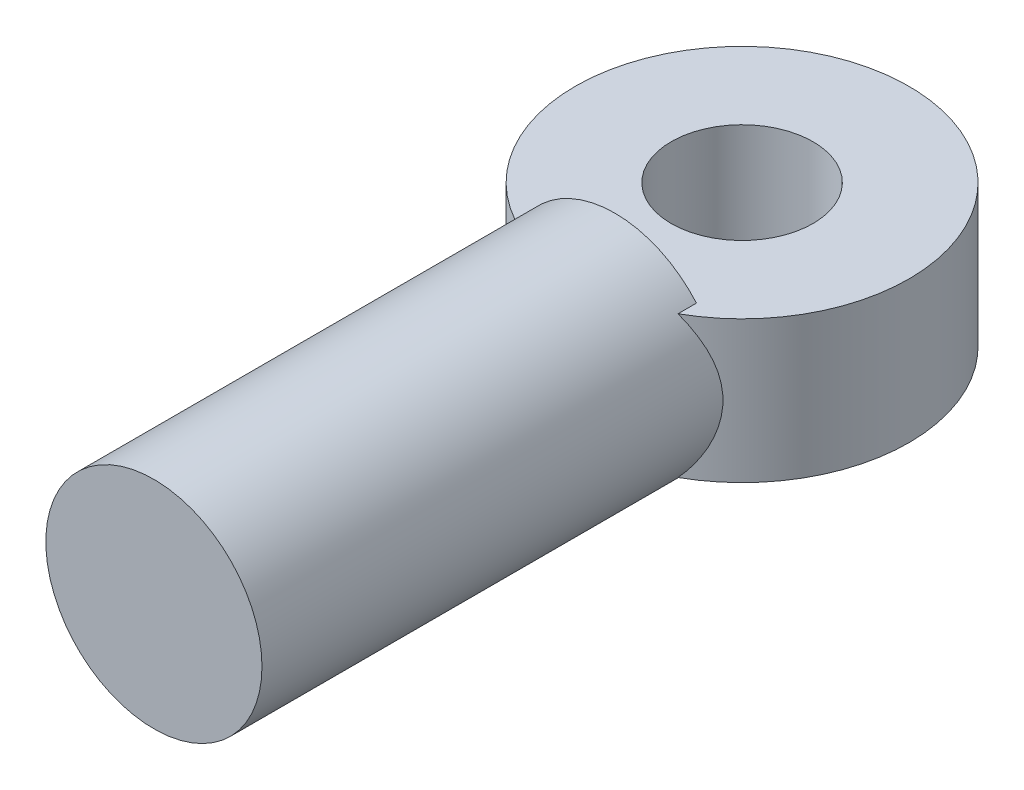
ISO-10303-21;
HEADER;
FILE_DESCRIPTION(('STEP AP214'),'2;1');
FILE_NAME('part.step','',(''),(''),'','','');
FILE_SCHEMA(('AUTOMOTIVE_DESIGN { 1 0 10303 214 1 1 1 1 }'));
ENDSEC;
DATA;
#1=APPLICATION_CONTEXT('core data for automotive mechanical design processes');
#2=APPLICATION_PROTOCOL_DEFINITION('international standard','automotive_design',2000,#1);
#3=PRODUCT_CONTEXT('',#1,'mechanical');
#4=PRODUCT('Part','Part','',(#3));
#5=PRODUCT_RELATED_PRODUCT_CATEGORY('part','',(#4));
#6=PRODUCT_DEFINITION_FORMATION('','',#4);
#7=PRODUCT_DEFINITION_CONTEXT('part definition',#1,'design');
#8=PRODUCT_DEFINITION('design','',#6,#7);
#9=PRODUCT_DEFINITION_SHAPE('','',#8);
#10=(LENGTH_UNIT() NAMED_UNIT(*) SI_UNIT(.MILLI.,.METRE.));
#11=(NAMED_UNIT(*) PLANE_ANGLE_UNIT() SI_UNIT($,.RADIAN.));
#12=(NAMED_UNIT(*) SI_UNIT($,.STERADIAN.) SOLID_ANGLE_UNIT());
#13=UNCERTAINTY_MEASURE_WITH_UNIT(LENGTH_MEASURE(1.E-05),#10,'distance_accuracy_value','');
#14=(GEOMETRIC_REPRESENTATION_CONTEXT(3) GLOBAL_UNCERTAINTY_ASSIGNED_CONTEXT((#13)) GLOBAL_UNIT_ASSIGNED_CONTEXT((#10,
#11,#12)) REPRESENTATION_CONTEXT('',''));
#15=CARTESIAN_POINT('',(0.,0.,0.));
#16=DIRECTION('',(0.,0.,1.));
#17=DIRECTION('',(1.,0.,0.));
#18=AXIS2_PLACEMENT_3D('',#15,#16,#17);
#19=CARTESIAN_POINT('',(0.,0.,130.));
#20=DIRECTION('',(0.,0.,-1.));
#21=DIRECTION('',(-1.,0.,0.));
#22=AXIS2_PLACEMENT_3D('',#19,#20,#21);
#23=CYLINDRICAL_SURFACE('',#22,30.475);
#24=CARTESIAN_POINT('',(0.,0.,130.));
#25=DIRECTION('',(0.,0.,1.));
#26=DIRECTION('',(1.,0.,0.));
#27=AXIS2_PLACEMENT_3D('',#24,#25,#26);
#28=CIRCLE('',#27,30.475);
#29=CARTESIAN_POINT('',(30.475,0.,130.));
#30=VERTEX_POINT('',#29);
#31=EDGE_CURVE('E89',#30,#30,#28,.T.);
#32=ORIENTED_EDGE('',*,*,#31,.F.);
#33=EDGE_LOOP('',(#32));
#34=FACE_BOUND('',#33,.T.);
#35=CARTESIAN_POINT('',(22.994034552466,20.,5.20044101858887));
#36=CARTESIAN_POINT('',(23.2608627606317,19.6932167851979,5.0510105347455));
#37=CARTESIAN_POINT('',(23.5215381915526,19.381129315537,4.90160505695657));
#38=CARTESIAN_POINT('',(24.0303988975387,18.7464955657177,4.6036870782934));
#39=CARTESIAN_POINT('',(24.2785836318345,18.4239488337306,4.45517461632586));
#40=CARTESIAN_POINT('',(25.0044555233946,17.4403909240791,4.0120382310546));
#41=CARTESIAN_POINT('',(25.4630575761795,16.7639249251453,3.7200431066798));
#42=CARTESIAN_POINT('',(26.3305801628501,15.3658376380825,3.14833652555004));
#43=CARTESIAN_POINT('',(26.7390371257926,14.6438766549575,2.86875302352362));
#44=CARTESIAN_POINT('',(27.498616841986,13.1622268551506,2.33314396882924));
#45=CARTESIAN_POINT('',(27.8497621900792,12.402553061372,2.07710914966177));
#46=CARTESIAN_POINT('',(28.4369507095093,10.9796775832088,1.63829560516049));
#47=CARTESIAN_POINT('',(28.6824159286412,10.3219194580273,1.45045339790217));
#48=CARTESIAN_POINT('',(29.1291163895994,8.98427724242844,1.10274151145618));
#49=CARTESIAN_POINT('',(29.3303542471918,8.30439446327515,0.942870178083905));
#50=CARTESIAN_POINT('',(29.6855378881333,6.92803746822048,0.656962159062035));
#51=CARTESIAN_POINT('',(29.839650192946,6.23163126737512,0.530806540517424));
#52=CARTESIAN_POINT('',(30.099279236282,4.8240115852771,0.316350118499478));
#53=CARTESIAN_POINT('',(30.2047971165537,4.11279845233054,0.228048425634087));
#54=CARTESIAN_POINT('',(30.3660200497119,2.67532616820119,0.0924922603360886));
#55=CARTESIAN_POINT('',(30.4213435011484,1.94899400247953,0.0455523154738384));
#56=CARTESIAN_POINT('',(30.4797289961815,0.492699810239906,-0.00399859933806714));
#57=CARTESIAN_POINT('',(30.4827911039367,-0.237262211820756,-0.00660962370810891));
#58=CARTESIAN_POINT('',(30.4365831898761,-1.69466320939582,0.0326265019580304));
#59=CARTESIAN_POINT('',(30.3872873558604,-2.42210076290578,0.0744955804617325));
#60=CARTESIAN_POINT('',(30.2372853522793,-3.86786616525834,0.200811383262043));
#61=CARTESIAN_POINT('',(30.1365801505275,-4.58619418533277,0.285257306022325));
#62=CARTESIAN_POINT('',(29.8975212450236,-5.94062060959554,0.483181938963667));
#63=CARTESIAN_POINT('',(29.763657829504,-6.57804331090867,0.593136586533963));
#64=CARTESIAN_POINT('',(29.4569747546435,-7.83789149491519,0.841417134090041));
#65=CARTESIAN_POINT('',(29.2841514358959,-8.46031556274158,0.979745699057118));
#66=CARTESIAN_POINT('',(28.9969543012618,-9.3811505990774,1.20563608798631));
#67=CARTESIAN_POINT('',(28.8964534742172,-9.68624396109955,1.2840818864562));
#68=CARTESIAN_POINT('',(28.6863914963508,-10.2917055110156,1.44656012393503));
#69=CARTESIAN_POINT('',(28.5768325244269,-10.5920748146898,1.530591218477));
#70=CARTESIAN_POINT('',(28.2348349315823,-11.4859390771215,1.7903419536873));
#71=CARTESIAN_POINT('',(27.9890803491207,-12.0721753148364,1.97371530375355));
#72=CARTESIAN_POINT('',(27.4182274952725,-13.3235884418352,2.38997690140687));
#73=CARTESIAN_POINT('',(27.0867601611449,-13.9848292255156,2.62593770093779));
#74=CARTESIAN_POINT('',(26.3795307763607,-15.2770612366278,3.11412466884062));
#75=CARTESIAN_POINT('',(26.0037581828735,-15.9080452137315,3.36635470212777));
#76=CARTESIAN_POINT('',(25.2120584164382,-17.1349970688917,3.87982399317274));
#77=CARTESIAN_POINT('',(24.7963585934392,-17.7311353521741,4.14100736345609));
#78=CARTESIAN_POINT('',(23.9248940596249,-18.8904708528855,4.6682974355996));
#79=CARTESIAN_POINT('',(23.4691528347827,-19.453687061879,4.93440118007924));
#80=CARTESIAN_POINT('',(22.994034552466,-20.,5.20044101858887));
#81=B_SPLINE_CURVE_WITH_KNOTS('',3,(#35,#36,#37,#38,#39,#40,#41,#42,#43,#44,#45,#46,#47,#48,#49,
#50,#51,#52,#53,#54,#55,#56,#57,#58,#59,#60,#61,#62,#63,#64,#65,#66,#67,#68,#69,#70,#71,#72,#73,
#74,#75,#76,#77,#78,#79,#80),.UNSPECIFIED.,.F.,.F.,(4,2,2,2,2,2,2,2,2,2,2,2,2,2,2,2,2,2,2,2,2,2,
4),(0.,1.29937057520426,2.59879735676656,5.19960945163365,7.82289654321589,10.445146904532,
12.6234152952694,14.8015548206402,16.9719063455603,19.1422068744694,21.3288720550141,
23.5155345510997,25.7032755612995,27.8909753874133,29.8706582047298,31.8505270462519,
32.8423352292634,33.8339055273623,35.8170947063017,38.1441325492506,40.4717252533956,
42.7867722442928,45.1004703134615),.UNSPECIFIED.);
#82=CARTESIAN_POINT('',(22.994034552466,20.,5.20044101858887));
#83=VERTEX_POINT('',#82);
#84=CARTESIAN_POINT('',(22.994034552466,-20.,5.20044101858887));
#85=VERTEX_POINT('',#84);
#86=EDGE_CURVE('E49',#83,#85,#81,.T.);
#87=ORIENTED_EDGE('',*,*,#86,.F.);
#88=DIRECTION('',(0.,0.,-1.));
#89=VECTOR('',#88,1.);
#90=CARTESIAN_POINT('',(22.994034552466,20.,130.));
#91=LINE('',#90,#89);
#92=CARTESIAN_POINT('',(22.994034552466,20.,0.));
#93=VERTEX_POINT('',#92);
#94=EDGE_CURVE('E195',#83,#93,#91,.T.);
#95=ORIENTED_EDGE('',*,*,#94,.T.);
#96=CARTESIAN_POINT('',(0.,0.,0.));
#97=DIRECTION('',(0.,0.,1.));
#98=DIRECTION('',(1.,0.,0.));
#99=AXIS2_PLACEMENT_3D('',#96,#97,#98);
#100=CIRCLE('',#99,30.475);
#101=CARTESIAN_POINT('',(-22.994034552466,20.,0.));
#102=VERTEX_POINT('',#101);
#103=EDGE_CURVE('E77',#93,#102,#100,.T.);
#104=ORIENTED_EDGE('',*,*,#103,.T.);
#105=DIRECTION('',(0.,0.,-1.));
#106=VECTOR('',#105,1.);
#107=CARTESIAN_POINT('',(-22.994034552466,20.,130.));
#108=LINE('',#107,#106);
#109=CARTESIAN_POINT('',(-22.994034552466,20.,5.20044101858887));
#110=VERTEX_POINT('',#109);
#111=EDGE_CURVE('E194',#102,#110,#108,.F.);
#112=ORIENTED_EDGE('',*,*,#111,.T.);
#113=CARTESIAN_POINT('',(-22.994034552466,-20.,5.20044101858887));
#114=CARTESIAN_POINT('',(-23.2607453373748,-19.6933532428766,5.05107656439186));
#115=CARTESIAN_POINT('',(-23.5213109912777,-19.3814020159014,4.90173540072261));
#116=CARTESIAN_POINT('',(-24.029956547805,-18.747057898321,4.60394872601959));
#117=CARTESIAN_POINT('',(-24.2780362319215,-18.4246648251428,4.45550323070024));
#118=CARTESIAN_POINT('',(-25.003628419681,-17.4415630614047,4.01255427935034));
#119=CARTESIAN_POINT('',(-25.4620641823545,-16.7654258541019,3.72068147280247));
#120=CARTESIAN_POINT('',(-26.3297264758448,-15.3673141358282,3.14891552267168));
#121=CARTESIAN_POINT('',(-26.7384439519203,-14.6449650818137,2.86916258587108));
#122=CARTESIAN_POINT('',(-27.3083771309743,-13.5333460733198,2.46729369756817));
#123=CARTESIAN_POINT('',(-27.4911369982993,-13.1581898717125,2.33631820595618));
#124=CARTESIAN_POINT('',(-27.8419671401901,-12.3986113056531,2.08133892609134));
#125=CARTESIAN_POINT('',(-28.0100335405742,-12.0141865312671,1.95733697958819));
#126=CARTESIAN_POINT('',(-28.4371676191001,-10.9791468551821,1.63813238469832));
#127=CARTESIAN_POINT('',(-28.6828682399565,-10.3207043749688,1.45010674203795));
#128=CARTESIAN_POINT('',(-29.1298860149142,-8.9818329066453,1.10213699084973));
#129=CARTESIAN_POINT('',(-29.3312131539418,-8.30140890441228,0.942186566485679));
#130=CARTESIAN_POINT('',(-29.686263027115,-6.92488475647562,0.656370664405394));
#131=CARTESIAN_POINT('',(-29.8402162714238,-6.22887878218739,0.530340526922319));
#132=CARTESIAN_POINT('',(-30.0995154635601,-4.82241344507967,0.316153399752916));
#133=CARTESIAN_POINT('',(-30.2048873885827,-4.1119620191691,0.227976171263119));
#134=CARTESIAN_POINT('',(-30.3481401042486,-2.83476951867256,0.107522844745147));
#135=CARTESIAN_POINT('',(-30.3956432320869,-2.26984504444637,0.0673181379662549));
#136=CARTESIAN_POINT('',(-30.4432184287596,-1.42009606080147,0.0269915630454188));
#137=CARTESIAN_POINT('',(-30.455130264681,-1.13635203985582,0.0168794142126274));
#138=CARTESIAN_POINT('',(-30.4710238265346,-0.56841999303895,0.00337989083354029));
#139=CARTESIAN_POINT('',(-30.4750034886023,-0.284231870861572,-5.73354429658651E-06));
#140=CARTESIAN_POINT('',(-30.4749907951539,0.749959559496128,1.5128234367062E-05));
#141=CARTESIAN_POINT('',(-30.4472511428128,1.50022369461355,0.0236406796206081));
#142=CARTESIAN_POINT('',(-30.3368277225729,2.99402342548334,0.117042242486003));
#143=CARTESIAN_POINT('',(-30.2541122484326,3.73755488732428,0.18684488560102));
#144=CARTESIAN_POINT('',(-30.035099213121,5.21305873668328,0.369542731067364));
#145=CARTESIAN_POINT('',(-29.8986771736111,5.94500013208553,0.482538025354262));
#146=CARTESIAN_POINT('',(-29.5746332062571,7.39021086848299,0.746730716963951));
#147=CARTESIAN_POINT('',(-29.3870168616082,8.10348223632018,0.897923948328086));
#148=CARTESIAN_POINT('',(-28.9652398093235,9.50096848516698,1.23118981333471));
#149=CARTESIAN_POINT('',(-28.7315286708023,10.1853920519441,1.41296186888039));
#150=CARTESIAN_POINT('',(-28.2189887786629,11.5296042006469,1.80250678528867));
#151=CARTESIAN_POINT('',(-27.9401530328659,12.1893889451895,2.01028367453742));
#152=CARTESIAN_POINT('',(-27.4899746093719,13.1587939616868,2.33698927669741));
#153=CARTESIAN_POINT('',(-27.3346122527186,13.4785179026806,2.44838541800349));
#154=CARTESIAN_POINT('',(-27.0135140529709,14.1110393079461,2.67549465768205));
#155=CARTESIAN_POINT('',(-26.8477809349862,14.4238385628039,2.79120661879152));
#156=CARTESIAN_POINT('',(-26.3353812494471,15.3516302039864,3.14380730830207));
#157=CARTESIAN_POINT('',(-25.9734423088638,15.9561712510324,3.38621360587509));
#158=CARTESIAN_POINT('',(-25.1987488220065,17.1543985689298,3.8882451346307));
#159=CARTESIAN_POINT('',(-24.7847636856952,17.747162031761,4.14817143919836));
#160=CARTESIAN_POINT('',(-24.1345743207373,18.6112171574771,4.54135117176792));
#161=CARTESIAN_POINT('',(-23.9132945481702,18.8946876854667,4.67277966297434));
#162=CARTESIAN_POINT('',(-23.4609575946565,19.4534900273551,4.93627937545639));
#163=CARTESIAN_POINT('',(-23.22989895524,19.7288206167468,5.0683506899879));
#164=CARTESIAN_POINT('',(-22.994034552466,20.,5.20044101858887));
#165=B_SPLINE_CURVE_WITH_KNOTS('',3,(#113,#114,#115,#116,#117,#118,#119,#120,#121,#122,#123,
#124,#125,#126,#127,#128,#129,#130,#131,#132,#133,#134,#135,#136,#137,#138,#139,#140,#141,#142,
#143,#144,#145,#146,#147,#148,#149,#150,#151,#152,#153,#154,#155,#156,#157,#158,#159,#160,#161,
#162,#163,#164),.UNSPECIFIED.,.F.,.F.,(4,2,2,2,2,2,2,2,2,2,2,2,2,2,2,2,2,2,2,2,2,2,2,2,2,4),(0.,
1.29880633601459,2.5976353936031,5.19738366999029,7.82183822715535,9.13362041054815,
10.4457474309812,12.6260614933041,14.8058844390582,16.9749267534878,19.1428078978988,
20.8462927238903,21.6986375152778,22.5512040484762,24.8007421447511,27.0515787456902,
29.3076632286553,31.5635017637722,33.7983393779519,36.0335236183702,37.1508820276414,
38.2679480532884,40.5015452211266,42.8046305969287,43.9530738664562,45.101689028455),.UNSPECIFIED.);
#166=CARTESIAN_POINT('',(-22.994034552466,-20.,5.20044101858887));
#167=VERTEX_POINT('',#166);
#168=EDGE_CURVE('E82',#167,#110,#165,.T.);
#169=ORIENTED_EDGE('',*,*,#168,.F.);
#170=DIRECTION('',(0.,0.,-1.));
#171=VECTOR('',#170,1.);
#172=CARTESIAN_POINT('',(-22.994034552466,-20.,130.));
#173=LINE('',#172,#171);
#174=CARTESIAN_POINT('',(-22.994034552466,-20.,0.));
#175=VERTEX_POINT('',#174);
#176=EDGE_CURVE('E80',#175,#167,#173,.F.);
#177=ORIENTED_EDGE('',*,*,#176,.F.);
#178=CARTESIAN_POINT('',(22.994034552466,-20.,0.));
#179=VERTEX_POINT('',#178);
#180=EDGE_CURVE('E72',#175,#179,#100,.T.);
#181=ORIENTED_EDGE('',*,*,#180,.T.);
#182=DIRECTION('',(0.,0.,-1.));
#183=VECTOR('',#182,1.);
#184=CARTESIAN_POINT('',(22.994034552466,-20.,130.));
#185=LINE('',#184,#183);
#186=EDGE_CURVE('E85',#85,#179,#185,.T.);
#187=ORIENTED_EDGE('',*,*,#186,.F.);
#188=EDGE_LOOP('',(#87,#95,#104,#112,#169,#177,#181,#187));
#189=FACE_BOUND('',#188,.T.);
#190=ADVANCED_FACE('F34',(#34,#189),#23,.T.);
#191=CARTESIAN_POINT('',(0.,0.,0.));
#192=DIRECTION('',(0.,0.,1.));
#193=DIRECTION('',(1.,0.,0.));
#194=AXIS2_PLACEMENT_3D('',#191,#192,#193);
#195=PLANE('',#194);
#196=DIRECTION('',(-1.,0.,0.));
#197=VECTOR('',#196,1.);
#198=CARTESIAN_POINT('',(0.,-20.,0.));
#199=LINE('',#198,#197);
#200=EDGE_CURVE('E42',#179,#175,#199,.T.);
#201=ORIENTED_EDGE('',*,*,#200,.F.);
#202=ORIENTED_EDGE('',*,*,#180,.F.);
#203=EDGE_LOOP('',(#201,#202));
#204=FACE_BOUND('',#203,.T.);
#205=ADVANCED_FACE('F74',(#204),#195,.F.);
#206=CARTESIAN_POINT('',(0.,0.,130.));
#207=DIRECTION('',(0.,0.,1.));
#208=DIRECTION('',(1.,0.,0.));
#209=AXIS2_PLACEMENT_3D('',#206,#207,#208);
#210=PLANE('',#209);
#211=ORIENTED_EDGE('',*,*,#31,.T.);
#212=EDGE_LOOP('',(#211));
#213=FACE_BOUND('',#212,.T.);
#214=ADVANCED_FACE('F112',(#213),#210,.T.);
#215=ORIENTED_EDGE('',*,*,#103,.F.);
#216=DIRECTION('',(-1.,0.,0.));
#217=VECTOR('',#216,1.);
#218=CARTESIAN_POINT('',(0.,20.,0.));
#219=LINE('',#218,#217);
#220=EDGE_CURVE('E11',#93,#102,#219,.T.);
#221=ORIENTED_EDGE('',*,*,#220,.T.);
#222=EDGE_LOOP('',(#215,#221));
#223=FACE_BOUND('',#222,.T.);
#224=ADVANCED_FACE('F110',(#223),#195,.F.);
#225=CARTESIAN_POINT('',(0.,20.,-35.8580562570614));
#226=DIRECTION('',(0.,-1.,0.));
#227=DIRECTION('',(0.,0.,-1.));
#228=AXIS2_PLACEMENT_3D('',#225,#226,#227);
#229=CYLINDRICAL_SURFACE('',#228,47.0587486397012);
#230=CARTESIAN_POINT('',(0.,20.,-35.8580562570614));
#231=DIRECTION('',(0.,1.,0.));
#232=DIRECTION('',(0.,0.,1.));
#233=AXIS2_PLACEMENT_3D('',#230,#231,#232);
#234=CIRCLE('',#233,47.0587486397012);
#235=EDGE_CURVE('E86',#83,#110,#234,.T.);
#236=ORIENTED_EDGE('',*,*,#235,.F.);
#237=ORIENTED_EDGE('',*,*,#86,.T.);
#238=CARTESIAN_POINT('',(0.,-20.,-35.8580562570614));
#239=DIRECTION('',(0.,1.,0.));
#240=DIRECTION('',(0.,0.,1.));
#241=AXIS2_PLACEMENT_3D('',#238,#239,#240);
#242=CIRCLE('',#241,47.0587486397012);
#243=EDGE_CURVE('E187',#85,#167,#242,.T.);
#244=ORIENTED_EDGE('',*,*,#243,.T.);
#245=ORIENTED_EDGE('',*,*,#168,.T.);
#246=EDGE_LOOP('',(#236,#237,#244,#245));
#247=FACE_BOUND('',#246,.T.);
#248=ADVANCED_FACE('F104',(#247),#229,.T.);
#249=CARTESIAN_POINT('',(0.,20.,0.));
#250=DIRECTION('',(0.,1.,0.));
#251=DIRECTION('',(0.,0.,1.));
#252=AXIS2_PLACEMENT_3D('',#249,#250,#251);
#253=PLANE('',#252);
#254=CARTESIAN_POINT('',(0.,20.,-35.8580562570614));
#255=DIRECTION('',(0.,1.,0.));
#256=DIRECTION('',(0.,0.,1.));
#257=AXIS2_PLACEMENT_3D('',#254,#255,#256);
#258=CIRCLE('',#257,20.);
#259=CARTESIAN_POINT('',(0.,20.,-15.8580562570614));
#260=VERTEX_POINT('',#259);
#261=EDGE_CURVE('E185',#260,#260,#258,.T.);
#262=ORIENTED_EDGE('',*,*,#261,.F.);
#263=EDGE_LOOP('',(#262));
#264=FACE_BOUND('',#263,.T.);
#265=ORIENTED_EDGE('',*,*,#94,.F.);
#266=ORIENTED_EDGE('',*,*,#235,.T.);
#267=ORIENTED_EDGE('',*,*,#111,.F.);
#268=ORIENTED_EDGE('',*,*,#220,.F.);
#269=EDGE_LOOP('',(#265,#266,#267,#268));
#270=FACE_BOUND('',#269,.T.);
#271=ADVANCED_FACE('F109',(#264,#270),#253,.T.);
#272=CARTESIAN_POINT('',(0.,-20.,0.));
#273=DIRECTION('',(0.,1.,0.));
#274=DIRECTION('',(0.,0.,1.));
#275=AXIS2_PLACEMENT_3D('',#272,#273,#274);
#276=PLANE('',#275);
#277=CARTESIAN_POINT('',(0.,-20.,-35.8580562570614));
#278=DIRECTION('',(0.,1.,0.));
#279=DIRECTION('',(0.,0.,1.));
#280=AXIS2_PLACEMENT_3D('',#277,#278,#279);
#281=CIRCLE('',#280,20.);
#282=CARTESIAN_POINT('',(0.,-20.,-15.8580562570614));
#283=VERTEX_POINT('',#282);
#284=EDGE_CURVE('E182',#283,#283,#281,.T.);
#285=ORIENTED_EDGE('',*,*,#284,.T.);
#286=EDGE_LOOP('',(#285));
#287=FACE_BOUND('',#286,.T.);
#288=ORIENTED_EDGE('',*,*,#243,.F.);
#289=ORIENTED_EDGE('',*,*,#186,.T.);
#290=ORIENTED_EDGE('',*,*,#200,.T.);
#291=ORIENTED_EDGE('',*,*,#176,.T.);
#292=EDGE_LOOP('',(#288,#289,#290,#291));
#293=FACE_BOUND('',#292,.T.);
#294=ADVANCED_FACE('F88',(#287,#293),#276,.F.);
#295=CARTESIAN_POINT('',(0.,-20.,-35.8580562570614));
#296=DIRECTION('',(0.,1.,0.));
#297=DIRECTION('',(0.,0.,1.));
#298=AXIS2_PLACEMENT_3D('',#295,#296,#297);
#299=CYLINDRICAL_SURFACE('',#298,20.);
#300=ORIENTED_EDGE('',*,*,#284,.F.);
#301=EDGE_LOOP('',(#300));
#302=FACE_BOUND('',#301,.T.);
#303=ORIENTED_EDGE('',*,*,#261,.T.);
#304=EDGE_LOOP('',(#303));
#305=FACE_BOUND('',#304,.T.);
#306=ADVANCED_FACE('F165',(#302,#305),#299,.F.);
#307=CLOSED_SHELL('',(#190,#205,#214,#224,#248,#271,#294,#306));
#308=MANIFOLD_SOLID_BREP('B2',#307);
#309=ADVANCED_BREP_SHAPE_REPRESENTATION('',(#18,#308),#14);
#310=SHAPE_DEFINITION_REPRESENTATION(#9,#309);
ENDSEC;
END-ISO-10303-21;
